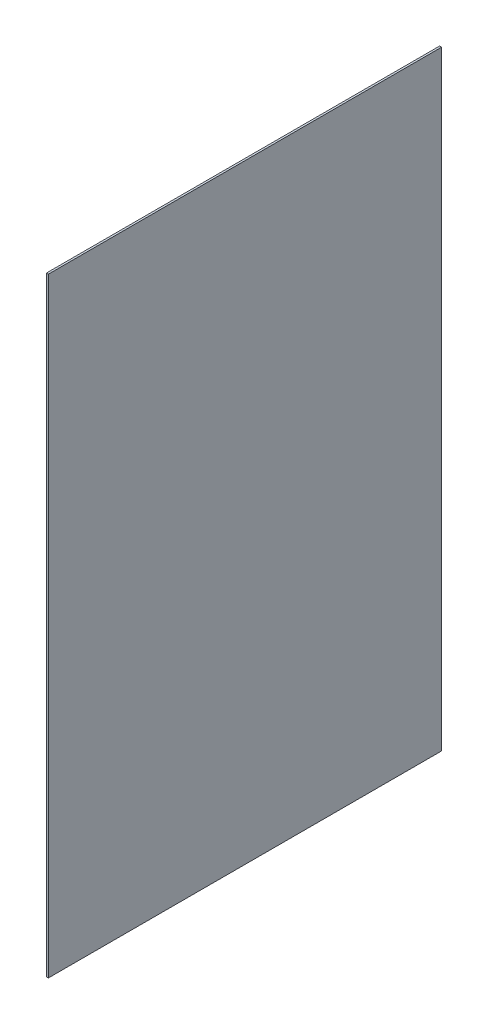
ISO-10303-21;
HEADER;
FILE_DESCRIPTION(('STEP AP214'),'2;1');
FILE_NAME('part.step','',(''),(''),'','','');
FILE_SCHEMA(('AUTOMOTIVE_DESIGN { 1 0 10303 214 1 1 1 1 }'));
ENDSEC;
DATA;
#1=APPLICATION_CONTEXT('core data for automotive mechanical design processes');
#2=APPLICATION_PROTOCOL_DEFINITION('international standard','automotive_design',2000,#1);
#3=PRODUCT_CONTEXT('',#1,'mechanical');
#4=PRODUCT('Part','Part','',(#3));
#5=PRODUCT_RELATED_PRODUCT_CATEGORY('part','',(#4));
#6=PRODUCT_DEFINITION_FORMATION('','',#4);
#7=PRODUCT_DEFINITION_CONTEXT('part definition',#1,'design');
#8=PRODUCT_DEFINITION('design','',#6,#7);
#9=PRODUCT_DEFINITION_SHAPE('','',#8);
#10=(LENGTH_UNIT() NAMED_UNIT(*) SI_UNIT(.MILLI.,.METRE.));
#11=(NAMED_UNIT(*) PLANE_ANGLE_UNIT() SI_UNIT($,.RADIAN.));
#12=(NAMED_UNIT(*) SI_UNIT($,.STERADIAN.) SOLID_ANGLE_UNIT());
#13=UNCERTAINTY_MEASURE_WITH_UNIT(LENGTH_MEASURE(1.E-05),#10,'distance_accuracy_value','');
#14=(GEOMETRIC_REPRESENTATION_CONTEXT(3) GLOBAL_UNCERTAINTY_ASSIGNED_CONTEXT((#13)) GLOBAL_UNIT_ASSIGNED_CONTEXT((#10,
#11,#12)) REPRESENTATION_CONTEXT('',''));
#15=CARTESIAN_POINT('',(0.,0.,0.));
#16=DIRECTION('',(0.,0.,1.));
#17=DIRECTION('',(1.,0.,0.));
#18=AXIS2_PLACEMENT_3D('',#15,#16,#17);
#19=CARTESIAN_POINT('',(2.54,393.7,254.));
#20=DIRECTION('',(0.,0.,-1.));
#21=DIRECTION('',(-1.,0.,0.));
#22=AXIS2_PLACEMENT_3D('',#19,#20,#21);
#23=PLANE('',#22);
#24=DIRECTION('',(0.,-1.,0.));
#25=VECTOR('',#24,1.);
#26=CARTESIAN_POINT('',(0.,393.7,254.));
#27=LINE('',#26,#25);
#28=CARTESIAN_POINT('',(0.,393.7,254.));
#29=VERTEX_POINT('',#28);
#30=CARTESIAN_POINT('',(0.,-393.7,254.));
#31=VERTEX_POINT('',#30);
#32=EDGE_CURVE('E96',#29,#31,#27,.T.);
#33=ORIENTED_EDGE('',*,*,#32,.T.);
#34=DIRECTION('',(-1.,0.,0.));
#35=VECTOR('',#34,1.);
#36=CARTESIAN_POINT('',(2.54,-393.7,254.));
#37=LINE('',#36,#35);
#38=CARTESIAN_POINT('',(2.54,-393.7,254.));
#39=VERTEX_POINT('',#38);
#40=EDGE_CURVE('E11',#39,#31,#37,.T.);
#41=ORIENTED_EDGE('',*,*,#40,.F.);
#42=DIRECTION('',(0.,-1.,0.));
#43=VECTOR('',#42,1.);
#44=CARTESIAN_POINT('',(2.54,393.7,254.));
#45=LINE('',#44,#43);
#46=CARTESIAN_POINT('',(2.54,393.7,254.));
#47=VERTEX_POINT('',#46);
#48=EDGE_CURVE('E84',#47,#39,#45,.T.);
#49=ORIENTED_EDGE('',*,*,#48,.F.);
#50=DIRECTION('',(-1.,0.,0.));
#51=VECTOR('',#50,1.);
#52=CARTESIAN_POINT('',(2.54,393.7,254.));
#53=LINE('',#52,#51);
#54=EDGE_CURVE('E92',#47,#29,#53,.T.);
#55=ORIENTED_EDGE('',*,*,#54,.T.);
#56=EDGE_LOOP('',(#33,#41,#49,#55));
#57=FACE_BOUND('',#56,.T.);
#58=ADVANCED_FACE('F33',(#57),#23,.F.);
#59=CARTESIAN_POINT('',(2.54,-393.7,-254.));
#60=DIRECTION('',(0.,1.,0.));
#61=DIRECTION('',(0.,0.,1.));
#62=AXIS2_PLACEMENT_3D('',#59,#60,#61);
#63=PLANE('',#62);
#64=DIRECTION('',(0.,0.,-1.));
#65=VECTOR('',#64,1.);
#66=CARTESIAN_POINT('',(0.,-393.7,-254.));
#67=LINE('',#66,#65);
#68=CARTESIAN_POINT('',(0.,-393.7,-254.));
#69=VERTEX_POINT('',#68);
#70=EDGE_CURVE('E88',#31,#69,#67,.T.);
#71=ORIENTED_EDGE('',*,*,#70,.T.);
#72=DIRECTION('',(-1.,0.,0.));
#73=VECTOR('',#72,1.);
#74=CARTESIAN_POINT('',(2.54,-393.7,-254.));
#75=LINE('',#74,#73);
#76=CARTESIAN_POINT('',(2.54,-393.7,-254.));
#77=VERTEX_POINT('',#76);
#78=EDGE_CURVE('E41',#77,#69,#75,.T.);
#79=ORIENTED_EDGE('',*,*,#78,.F.);
#80=DIRECTION('',(0.,0.,-1.));
#81=VECTOR('',#80,1.);
#82=CARTESIAN_POINT('',(2.54,-393.7,-254.));
#83=LINE('',#82,#81);
#84=EDGE_CURVE('E79',#39,#77,#83,.T.);
#85=ORIENTED_EDGE('',*,*,#84,.F.);
#86=ORIENTED_EDGE('',*,*,#40,.T.);
#87=EDGE_LOOP('',(#71,#79,#85,#86));
#88=FACE_BOUND('',#87,.T.);
#89=ADVANCED_FACE('F87',(#88),#63,.F.);
#90=CARTESIAN_POINT('',(2.54,393.7,-254.));
#91=DIRECTION('',(0.,0.,1.));
#92=DIRECTION('',(1.,0.,0.));
#93=AXIS2_PLACEMENT_3D('',#90,#91,#92);
#94=PLANE('',#93);
#95=DIRECTION('',(0.,1.,0.));
#96=VECTOR('',#95,1.);
#97=CARTESIAN_POINT('',(0.,393.7,-254.));
#98=LINE('',#97,#96);
#99=CARTESIAN_POINT('',(0.,393.7,-254.));
#100=VERTEX_POINT('',#99);
#101=EDGE_CURVE('E66',#69,#100,#98,.T.);
#102=ORIENTED_EDGE('',*,*,#101,.T.);
#103=DIRECTION('',(-1.,0.,0.));
#104=VECTOR('',#103,1.);
#105=CARTESIAN_POINT('',(2.54,393.7,-254.));
#106=LINE('',#105,#104);
#107=CARTESIAN_POINT('',(2.54,393.7,-254.));
#108=VERTEX_POINT('',#107);
#109=EDGE_CURVE('E89',#108,#100,#106,.T.);
#110=ORIENTED_EDGE('',*,*,#109,.F.);
#111=DIRECTION('',(0.,1.,0.));
#112=VECTOR('',#111,1.);
#113=CARTESIAN_POINT('',(2.54,393.7,-254.));
#114=LINE('',#113,#112);
#115=EDGE_CURVE('E82',#77,#108,#114,.T.);
#116=ORIENTED_EDGE('',*,*,#115,.F.);
#117=ORIENTED_EDGE('',*,*,#78,.T.);
#118=EDGE_LOOP('',(#102,#110,#116,#117));
#119=FACE_BOUND('',#118,.T.);
#120=ADVANCED_FACE('F90',(#119),#94,.F.);
#121=CARTESIAN_POINT('',(2.54,393.7,-254.));
#122=DIRECTION('',(0.,-1.,0.));
#123=DIRECTION('',(0.,0.,-1.));
#124=AXIS2_PLACEMENT_3D('',#121,#122,#123);
#125=PLANE('',#124);
#126=DIRECTION('',(0.,0.,1.));
#127=VECTOR('',#126,1.);
#128=CARTESIAN_POINT('',(0.,393.7,-254.));
#129=LINE('',#128,#127);
#130=EDGE_CURVE('E72',#100,#29,#129,.T.);
#131=ORIENTED_EDGE('',*,*,#130,.T.);
#132=ORIENTED_EDGE('',*,*,#54,.F.);
#133=DIRECTION('',(0.,0.,1.));
#134=VECTOR('',#133,1.);
#135=CARTESIAN_POINT('',(2.54,393.7,-254.));
#136=LINE('',#135,#134);
#137=EDGE_CURVE('E49',#108,#47,#136,.T.);
#138=ORIENTED_EDGE('',*,*,#137,.F.);
#139=ORIENTED_EDGE('',*,*,#109,.T.);
#140=EDGE_LOOP('',(#131,#132,#138,#139));
#141=FACE_BOUND('',#140,.T.);
#142=ADVANCED_FACE('F103',(#141),#125,.F.);
#143=CARTESIAN_POINT('',(2.54,0.,0.));
#144=DIRECTION('',(-1.,0.,0.));
#145=DIRECTION('',(0.,0.,1.));
#146=AXIS2_PLACEMENT_3D('',#143,#144,#145);
#147=PLANE('',#146);
#148=ORIENTED_EDGE('',*,*,#48,.T.);
#149=ORIENTED_EDGE('',*,*,#84,.T.);
#150=ORIENTED_EDGE('',*,*,#115,.T.);
#151=ORIENTED_EDGE('',*,*,#137,.T.);
#152=EDGE_LOOP('',(#148,#149,#150,#151));
#153=FACE_BOUND('',#152,.T.);
#154=ADVANCED_FACE('F80',(#153),#147,.F.);
#155=CARTESIAN_POINT('',(0.,0.,0.));
#156=DIRECTION('',(-1.,0.,0.));
#157=DIRECTION('',(0.,0.,1.));
#158=AXIS2_PLACEMENT_3D('',#155,#156,#157);
#159=PLANE('',#158);
#160=ORIENTED_EDGE('',*,*,#32,.F.);
#161=ORIENTED_EDGE('',*,*,#130,.F.);
#162=ORIENTED_EDGE('',*,*,#101,.F.);
#163=ORIENTED_EDGE('',*,*,#70,.F.);
#164=EDGE_LOOP('',(#160,#161,#162,#163));
#165=FACE_BOUND('',#164,.T.);
#166=ADVANCED_FACE('F106',(#165),#159,.T.);
#167=CLOSED_SHELL('',(#58,#89,#120,#142,#154,#166));
#168=MANIFOLD_SOLID_BREP('B2',#167);
#169=ADVANCED_BREP_SHAPE_REPRESENTATION('',(#18,#168),#14);
#170=SHAPE_DEFINITION_REPRESENTATION(#9,#169);
ENDSEC;
END-ISO-10303-21;
